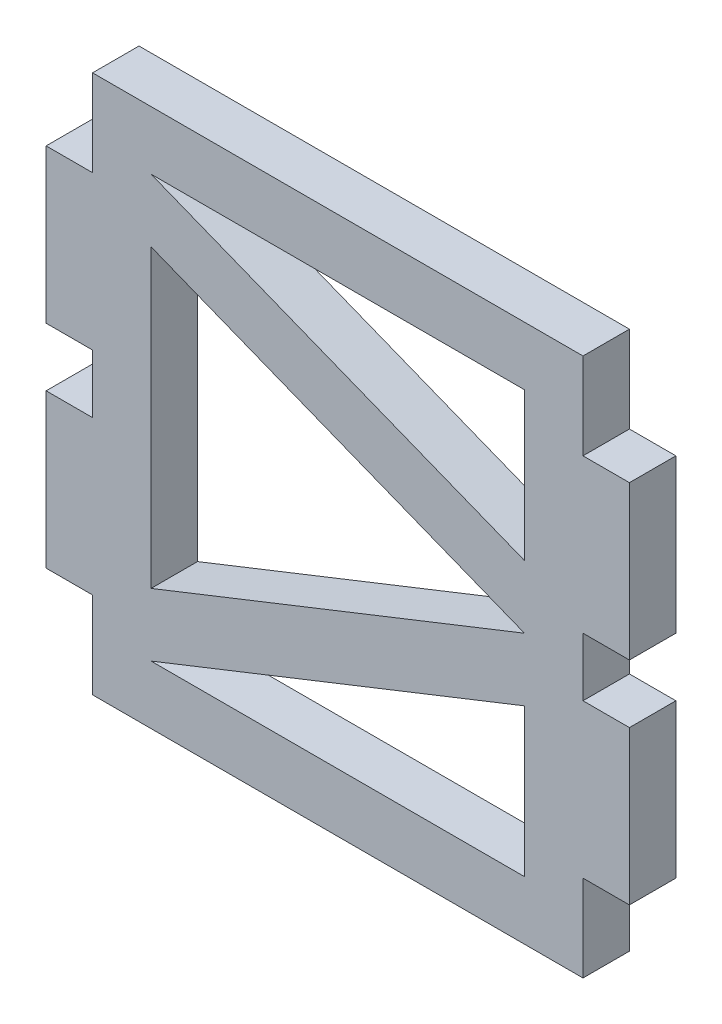
ISO-10303-21;
HEADER;
FILE_DESCRIPTION(('STEP AP214'),'2;1');
FILE_NAME('part.step','',(''),(''),'','','');
FILE_SCHEMA(('AUTOMOTIVE_DESIGN { 1 0 10303 214 1 1 1 1 }'));
ENDSEC;
DATA;
#1=APPLICATION_CONTEXT('core data for automotive mechanical design processes');
#2=APPLICATION_PROTOCOL_DEFINITION('international standard','automotive_design',2000,#1);
#3=PRODUCT_CONTEXT('',#1,'mechanical');
#4=PRODUCT('Part','Part','',(#3));
#5=PRODUCT_RELATED_PRODUCT_CATEGORY('part','',(#4));
#6=PRODUCT_DEFINITION_FORMATION('','',#4);
#7=PRODUCT_DEFINITION_CONTEXT('part definition',#1,'design');
#8=PRODUCT_DEFINITION('design','',#6,#7);
#9=PRODUCT_DEFINITION_SHAPE('','',#8);
#10=(LENGTH_UNIT() NAMED_UNIT(*) SI_UNIT(.MILLI.,.METRE.));
#11=(NAMED_UNIT(*) PLANE_ANGLE_UNIT() SI_UNIT($,.RADIAN.));
#12=(NAMED_UNIT(*) SI_UNIT($,.STERADIAN.) SOLID_ANGLE_UNIT());
#13=UNCERTAINTY_MEASURE_WITH_UNIT(LENGTH_MEASURE(1.E-05),#10,'distance_accuracy_value','');
#14=(GEOMETRIC_REPRESENTATION_CONTEXT(3) GLOBAL_UNCERTAINTY_ASSIGNED_CONTEXT((#13)) GLOBAL_UNIT_ASSIGNED_CONTEXT((#10,
#11,#12)) REPRESENTATION_CONTEXT('',''));
#15=CARTESIAN_POINT('',(0.,0.,0.));
#16=DIRECTION('',(0.,0.,1.));
#17=DIRECTION('',(1.,0.,0.));
#18=AXIS2_PLACEMENT_3D('',#15,#16,#17);
#19=CARTESIAN_POINT('',(7.175,50.1101546560199,57.452953627601));
#20=DIRECTION('',(1.,0.,0.));
#21=DIRECTION('',(0.,1.,0.));
#22=AXIS2_PLACEMENT_3D('',#19,#20,#21);
#23=PLANE('',#22);
#24=DIRECTION('',(0.,0.,-1.));
#25=VECTOR('',#24,1.);
#26=CARTESIAN_POINT('',(7.175,50.1101546560199,57.452953627601));
#27=LINE('',#26,#25);
#28=CARTESIAN_POINT('',(7.175,50.1101546560199,3.175));
#29=VERTEX_POINT('',#28);
#30=CARTESIAN_POINT('',(7.175,50.1101546560199,0.));
#31=VERTEX_POINT('',#30);
#32=EDGE_CURVE('E282',#29,#31,#27,.T.);
#33=ORIENTED_EDGE('',*,*,#32,.F.);
#34=DIRECTION('',(0.,-1.,0.));
#35=VECTOR('',#34,1.);
#36=CARTESIAN_POINT('',(7.175,50.1101546560199,3.175));
#37=LINE('',#36,#35);
#38=CARTESIAN_POINT('',(7.175,29.8898453439801,3.175));
#39=VERTEX_POINT('',#38);
#40=EDGE_CURVE('E589',#29,#39,#37,.T.);
#41=ORIENTED_EDGE('',*,*,#40,.T.);
#42=DIRECTION('',(0.,0.,-1.));
#43=VECTOR('',#42,1.);
#44=CARTESIAN_POINT('',(7.175,29.8898453439801,57.452953627601));
#45=LINE('',#44,#43);
#46=CARTESIAN_POINT('',(7.175,29.8898453439801,0.));
#47=VERTEX_POINT('',#46);
#48=EDGE_CURVE('E280',#39,#47,#45,.T.);
#49=ORIENTED_EDGE('',*,*,#48,.T.);
#50=DIRECTION('',(0.,-1.,0.));
#51=VECTOR('',#50,1.);
#52=CARTESIAN_POINT('',(7.175,50.1101546560199,0.));
#53=LINE('',#52,#51);
#54=EDGE_CURVE('E277',#31,#47,#53,.T.);
#55=ORIENTED_EDGE('',*,*,#54,.F.);
#56=EDGE_LOOP('',(#33,#41,#49,#55));
#57=FACE_BOUND('',#56,.T.);
#58=ADVANCED_FACE('F37',(#57),#23,.T.);
#59=CARTESIAN_POINT('',(32.7,40.,57.452953627601));
#60=DIRECTION('',(-0.368253405634251,-0.92972545906777,0.));
#61=DIRECTION('',(0.92972545906777,-0.368253405634251,0.));
#62=AXIS2_PLACEMENT_3D('',#59,#60,#61);
#63=PLANE('',#62);
#64=DIRECTION('',(0.,0.,-1.));
#65=VECTOR('',#64,1.);
#66=CARTESIAN_POINT('',(32.7,40.,57.452953627601));
#67=LINE('',#66,#65);
#68=CARTESIAN_POINT('',(32.7,40.,3.175));
#69=VERTEX_POINT('',#68);
#70=CARTESIAN_POINT('',(32.7,40.,0.));
#71=VERTEX_POINT('',#70);
#72=EDGE_CURVE('E284',#69,#71,#67,.T.);
#73=ORIENTED_EDGE('',*,*,#72,.F.);
#74=DIRECTION('',(-0.92972545906777,0.368253405634251,0.));
#75=VECTOR('',#74,1.);
#76=CARTESIAN_POINT('',(32.7,40.,3.175));
#77=LINE('',#76,#75);
#78=EDGE_CURVE('E585',#69,#29,#77,.T.);
#79=ORIENTED_EDGE('',*,*,#78,.T.);
#80=ORIENTED_EDGE('',*,*,#32,.T.);
#81=DIRECTION('',(-0.92972545906777,0.368253405634251,0.));
#82=VECTOR('',#81,1.);
#83=CARTESIAN_POINT('',(32.7,40.,0.));
#84=LINE('',#83,#82);
#85=EDGE_CURVE('E274',#71,#31,#84,.T.);
#86=ORIENTED_EDGE('',*,*,#85,.F.);
#87=EDGE_LOOP('',(#73,#79,#80,#86));
#88=FACE_BOUND('',#87,.T.);
#89=ADVANCED_FACE('F638',(#88),#63,.T.);
#90=CARTESIAN_POINT('',(7.175,29.8898453439801,57.452953627601));
#91=DIRECTION('',(-0.368253405634251,0.92972545906777,0.));
#92=DIRECTION('',(-0.92972545906777,-0.368253405634251,0.));
#93=AXIS2_PLACEMENT_3D('',#90,#91,#92);
#94=PLANE('',#93);
#95=ORIENTED_EDGE('',*,*,#48,.F.);
#96=DIRECTION('',(0.92972545906777,0.368253405634251,0.));
#97=VECTOR('',#96,1.);
#98=CARTESIAN_POINT('',(7.175,29.8898453439801,3.175));
#99=LINE('',#98,#97);
#100=EDGE_CURVE('E62',#39,#69,#99,.T.);
#101=ORIENTED_EDGE('',*,*,#100,.T.);
#102=ORIENTED_EDGE('',*,*,#72,.T.);
#103=DIRECTION('',(0.92972545906777,0.368253405634251,0.));
#104=VECTOR('',#103,1.);
#105=CARTESIAN_POINT('',(7.175,29.8898453439801,0.));
#106=LINE('',#105,#104);
#107=EDGE_CURVE('E271',#47,#71,#106,.T.);
#108=ORIENTED_EDGE('',*,*,#107,.F.);
#109=EDGE_LOOP('',(#95,#101,#102,#108));
#110=FACE_BOUND('',#109,.T.);
#111=ADVANCED_FACE('F644',(#110),#94,.T.);
#112=CARTESIAN_POINT('',(3.175,27.5,57.452953627601));
#113=DIRECTION('',(0.,1.,0.));
#114=DIRECTION('',(0.,0.,1.));
#115=AXIS2_PLACEMENT_3D('',#112,#113,#114);
#116=PLANE('',#115);
#117=DIRECTION('',(1.,0.,0.));
#118=VECTOR('',#117,1.);
#119=CARTESIAN_POINT('',(3.175,27.5,3.175));
#120=LINE('',#119,#118);
#121=CARTESIAN_POINT('',(0.,27.5,3.175));
#122=VERTEX_POINT('',#121);
#123=CARTESIAN_POINT('',(3.175,27.5,3.175));
#124=VERTEX_POINT('',#123);
#125=EDGE_CURVE('E575',#122,#124,#120,.T.);
#126=ORIENTED_EDGE('',*,*,#125,.F.);
#127=DIRECTION('',(0.,0.,-1.));
#128=VECTOR('',#127,1.);
#129=CARTESIAN_POINT('',(0.,27.5,57.452953627601));
#130=LINE('',#129,#128);
#131=CARTESIAN_POINT('',(0.,27.5,0.));
#132=VERTEX_POINT('',#131);
#133=EDGE_CURVE('E54',#122,#132,#130,.T.);
#134=ORIENTED_EDGE('',*,*,#133,.T.);
#135=DIRECTION('',(1.,0.,0.));
#136=VECTOR('',#135,1.);
#137=CARTESIAN_POINT('',(3.175,27.5,0.));
#138=LINE('',#137,#136);
#139=CARTESIAN_POINT('',(3.175,27.5,0.));
#140=VERTEX_POINT('',#139);
#141=EDGE_CURVE('E342',#132,#140,#138,.T.);
#142=ORIENTED_EDGE('',*,*,#141,.T.);
#143=DIRECTION('',(0.,0.,-1.));
#144=VECTOR('',#143,1.);
#145=CARTESIAN_POINT('',(3.175,27.5,57.452953627601));
#146=LINE('',#145,#144);
#147=EDGE_CURVE('E345',#124,#140,#146,.T.);
#148=ORIENTED_EDGE('',*,*,#147,.F.);
#149=EDGE_LOOP('',(#126,#134,#142,#148));
#150=FACE_BOUND('',#149,.T.);
#151=ADVANCED_FACE('F401',(#150),#116,.F.);
#152=CARTESIAN_POINT('',(0.,27.5,57.452953627601));
#153=DIRECTION('',(1.,0.,0.));
#154=DIRECTION('',(0.,0.,-1.));
#155=AXIS2_PLACEMENT_3D('',#152,#153,#154);
#156=PLANE('',#155);
#157=DIRECTION('',(0.,-1.,0.));
#158=VECTOR('',#157,1.);
#159=CARTESIAN_POINT('',(0.,27.5,3.175));
#160=LINE('',#159,#158);
#161=CARTESIAN_POINT('',(0.,38.,3.175));
#162=VERTEX_POINT('',#161);
#163=EDGE_CURVE('E408',#162,#122,#160,.T.);
#164=ORIENTED_EDGE('',*,*,#163,.F.);
#165=DIRECTION('',(0.,0.,-1.));
#166=VECTOR('',#165,1.);
#167=CARTESIAN_POINT('',(0.,38.,57.452953627601));
#168=LINE('',#167,#166);
#169=CARTESIAN_POINT('',(0.,38.,0.));
#170=VERTEX_POINT('',#169);
#171=EDGE_CURVE('E348',#162,#170,#168,.T.);
#172=ORIENTED_EDGE('',*,*,#171,.T.);
#173=DIRECTION('',(0.,-1.,0.));
#174=VECTOR('',#173,1.);
#175=CARTESIAN_POINT('',(0.,27.5,0.));
#176=LINE('',#175,#174);
#177=EDGE_CURVE('E340',#170,#132,#176,.T.);
#178=ORIENTED_EDGE('',*,*,#177,.T.);
#179=ORIENTED_EDGE('',*,*,#133,.F.);
#180=EDGE_LOOP('',(#164,#172,#178,#179));
#181=FACE_BOUND('',#180,.T.);
#182=ADVANCED_FACE('F405',(#181),#156,.F.);
#183=CARTESIAN_POINT('',(3.175,38.,57.452953627601));
#184=DIRECTION('',(0.,-1.,0.));
#185=DIRECTION('',(0.,0.,-1.));
#186=AXIS2_PLACEMENT_3D('',#183,#184,#185);
#187=PLANE('',#186);
#188=DIRECTION('',(-1.,0.,0.));
#189=VECTOR('',#188,1.);
#190=CARTESIAN_POINT('',(3.175,38.,3.175));
#191=LINE('',#190,#189);
#192=CARTESIAN_POINT('',(3.175,38.,3.175));
#193=VERTEX_POINT('',#192);
#194=EDGE_CURVE('E413',#193,#162,#191,.T.);
#195=ORIENTED_EDGE('',*,*,#194,.F.);
#196=DIRECTION('',(0.,0.,-1.));
#197=VECTOR('',#196,1.);
#198=CARTESIAN_POINT('',(3.175,38.,57.452953627601));
#199=LINE('',#198,#197);
#200=CARTESIAN_POINT('',(3.175,38.,0.));
#201=VERTEX_POINT('',#200);
#202=EDGE_CURVE('E350',#193,#201,#199,.T.);
#203=ORIENTED_EDGE('',*,*,#202,.T.);
#204=DIRECTION('',(-1.,0.,0.));
#205=VECTOR('',#204,1.);
#206=CARTESIAN_POINT('',(3.175,38.,0.));
#207=LINE('',#206,#205);
#208=EDGE_CURVE('E337',#201,#170,#207,.T.);
#209=ORIENTED_EDGE('',*,*,#208,.T.);
#210=ORIENTED_EDGE('',*,*,#171,.F.);
#211=EDGE_LOOP('',(#195,#203,#209,#210));
#212=FACE_BOUND('',#211,.T.);
#213=ADVANCED_FACE('F411',(#212),#187,.F.);
#214=CARTESIAN_POINT('',(3.175,42.,57.452953627601));
#215=DIRECTION('',(1.,0.,0.));
#216=DIRECTION('',(0.,0.,-1.));
#217=AXIS2_PLACEMENT_3D('',#214,#215,#216);
#218=PLANE('',#217);
#219=DIRECTION('',(0.,-1.,0.));
#220=VECTOR('',#219,1.);
#221=CARTESIAN_POINT('',(3.175,42.,3.175));
#222=LINE('',#221,#220);
#223=CARTESIAN_POINT('',(3.175,42.,3.175));
#224=VERTEX_POINT('',#223);
#225=EDGE_CURVE('E566',#224,#193,#222,.T.);
#226=ORIENTED_EDGE('',*,*,#225,.F.);
#227=DIRECTION('',(0.,0.,-1.));
#228=VECTOR('',#227,1.);
#229=CARTESIAN_POINT('',(3.175,42.,57.452953627601));
#230=LINE('',#229,#228);
#231=CARTESIAN_POINT('',(3.175,42.,0.));
#232=VERTEX_POINT('',#231);
#233=EDGE_CURVE('E352',#224,#232,#230,.T.);
#234=ORIENTED_EDGE('',*,*,#233,.T.);
#235=DIRECTION('',(0.,-1.,0.));
#236=VECTOR('',#235,1.);
#237=CARTESIAN_POINT('',(3.175,42.,0.));
#238=LINE('',#237,#236);
#239=EDGE_CURVE('E334',#232,#201,#238,.T.);
#240=ORIENTED_EDGE('',*,*,#239,.T.);
#241=ORIENTED_EDGE('',*,*,#202,.F.);
#242=EDGE_LOOP('',(#226,#234,#240,#241));
#243=FACE_BOUND('',#242,.T.);
#244=ADVANCED_FACE('F416',(#243),#218,.F.);
#245=CARTESIAN_POINT('',(3.175,42.,57.452953627601));
#246=DIRECTION('',(0.,1.,0.));
#247=DIRECTION('',(0.,0.,1.));
#248=AXIS2_PLACEMENT_3D('',#245,#246,#247);
#249=PLANE('',#248);
#250=DIRECTION('',(1.,0.,0.));
#251=VECTOR('',#250,1.);
#252=CARTESIAN_POINT('',(3.175,42.,3.175));
#253=LINE('',#252,#251);
#254=CARTESIAN_POINT('',(0.,42.,3.175));
#255=VERTEX_POINT('',#254);
#256=EDGE_CURVE('E425',#255,#224,#253,.T.);
#257=ORIENTED_EDGE('',*,*,#256,.F.);
#258=DIRECTION('',(0.,0.,-1.));
#259=VECTOR('',#258,1.);
#260=CARTESIAN_POINT('',(0.,42.,57.452953627601));
#261=LINE('',#260,#259);
#262=CARTESIAN_POINT('',(0.,42.,0.));
#263=VERTEX_POINT('',#262);
#264=EDGE_CURVE('E354',#255,#263,#261,.T.);
#265=ORIENTED_EDGE('',*,*,#264,.T.);
#266=DIRECTION('',(1.,0.,0.));
#267=VECTOR('',#266,1.);
#268=CARTESIAN_POINT('',(3.175,42.,0.));
#269=LINE('',#268,#267);
#270=EDGE_CURVE('E331',#263,#232,#269,.T.);
#271=ORIENTED_EDGE('',*,*,#270,.T.);
#272=ORIENTED_EDGE('',*,*,#233,.F.);
#273=EDGE_LOOP('',(#257,#265,#271,#272));
#274=FACE_BOUND('',#273,.T.);
#275=ADVANCED_FACE('F422',(#274),#249,.F.);
#276=CARTESIAN_POINT('',(0.,42.,57.452953627601));
#277=DIRECTION('',(1.,0.,0.));
#278=DIRECTION('',(0.,0.,-1.));
#279=AXIS2_PLACEMENT_3D('',#276,#277,#278);
#280=PLANE('',#279);
#281=DIRECTION('',(0.,-1.,0.));
#282=VECTOR('',#281,1.);
#283=CARTESIAN_POINT('',(0.,42.,3.175));
#284=LINE('',#283,#282);
#285=CARTESIAN_POINT('',(0.,52.5000000000001,3.175));
#286=VERTEX_POINT('',#285);
#287=EDGE_CURVE('E430',#286,#255,#284,.T.);
#288=ORIENTED_EDGE('',*,*,#287,.F.);
#289=DIRECTION('',(0.,0.,-1.));
#290=VECTOR('',#289,1.);
#291=CARTESIAN_POINT('',(0.,52.5000000000001,57.452953627601));
#292=LINE('',#291,#290);
#293=CARTESIAN_POINT('',(0.,52.5000000000001,0.));
#294=VERTEX_POINT('',#293);
#295=EDGE_CURVE('E356',#286,#294,#292,.T.);
#296=ORIENTED_EDGE('',*,*,#295,.T.);
#297=DIRECTION('',(0.,-1.,0.));
#298=VECTOR('',#297,1.);
#299=CARTESIAN_POINT('',(0.,42.,0.));
#300=LINE('',#299,#298);
#301=EDGE_CURVE('E328',#294,#263,#300,.T.);
#302=ORIENTED_EDGE('',*,*,#301,.T.);
#303=ORIENTED_EDGE('',*,*,#264,.F.);
#304=EDGE_LOOP('',(#288,#296,#302,#303));
#305=FACE_BOUND('',#304,.T.);
#306=ADVANCED_FACE('F428',(#305),#280,.F.);
#307=CARTESIAN_POINT('',(3.175,52.5000000000001,57.452953627601));
#308=DIRECTION('',(0.,-1.,0.));
#309=DIRECTION('',(0.,0.,-1.));
#310=AXIS2_PLACEMENT_3D('',#307,#308,#309);
#311=PLANE('',#310);
#312=DIRECTION('',(-1.,0.,0.));
#313=VECTOR('',#312,1.);
#314=CARTESIAN_POINT('',(3.175,52.5000000000001,3.175));
#315=LINE('',#314,#313);
#316=CARTESIAN_POINT('',(3.175,52.5000000000001,3.175));
#317=VERTEX_POINT('',#316);
#318=EDGE_CURVE('E554',#317,#286,#315,.T.);
#319=ORIENTED_EDGE('',*,*,#318,.F.);
#320=DIRECTION('',(0.,0.,-1.));
#321=VECTOR('',#320,1.);
#322=CARTESIAN_POINT('',(3.175,52.5000000000001,57.452953627601));
#323=LINE('',#322,#321);
#324=CARTESIAN_POINT('',(3.175,52.5000000000001,0.));
#325=VERTEX_POINT('',#324);
#326=EDGE_CURVE('E358',#317,#325,#323,.T.);
#327=ORIENTED_EDGE('',*,*,#326,.T.);
#328=DIRECTION('',(-1.,0.,0.));
#329=VECTOR('',#328,1.);
#330=CARTESIAN_POINT('',(3.175,52.5000000000001,0.));
#331=LINE('',#330,#329);
#332=EDGE_CURVE('E325',#325,#294,#331,.T.);
#333=ORIENTED_EDGE('',*,*,#332,.T.);
#334=ORIENTED_EDGE('',*,*,#295,.F.);
#335=EDGE_LOOP('',(#319,#327,#333,#334));
#336=FACE_BOUND('',#335,.T.);
#337=ADVANCED_FACE('F433',(#336),#311,.F.);
#338=CARTESIAN_POINT('',(3.175,58.4125,57.452953627601));
#339=DIRECTION('',(1.,0.,0.));
#340=DIRECTION('',(0.,0.,-1.));
#341=AXIS2_PLACEMENT_3D('',#338,#339,#340);
#342=PLANE('',#341);
#343=DIRECTION('',(0.,-1.,0.));
#344=VECTOR('',#343,1.);
#345=CARTESIAN_POINT('',(3.175,58.4125,3.175));
#346=LINE('',#345,#344);
#347=CARTESIAN_POINT('',(3.175,58.4125,3.175));
#348=VERTEX_POINT('',#347);
#349=EDGE_CURVE('E442',#348,#317,#346,.T.);
#350=ORIENTED_EDGE('',*,*,#349,.F.);
#351=DIRECTION('',(0.,0.,-1.));
#352=VECTOR('',#351,1.);
#353=CARTESIAN_POINT('',(3.175,58.4125,57.452953627601));
#354=LINE('',#353,#352);
#355=CARTESIAN_POINT('',(3.175,58.4125,0.));
#356=VERTEX_POINT('',#355);
#357=EDGE_CURVE('E360',#348,#356,#354,.T.);
#358=ORIENTED_EDGE('',*,*,#357,.T.);
#359=DIRECTION('',(0.,-1.,0.));
#360=VECTOR('',#359,1.);
#361=CARTESIAN_POINT('',(3.175,58.4125,0.));
#362=LINE('',#361,#360);
#363=EDGE_CURVE('E322',#356,#325,#362,.T.);
#364=ORIENTED_EDGE('',*,*,#363,.T.);
#365=ORIENTED_EDGE('',*,*,#326,.F.);
#366=EDGE_LOOP('',(#350,#358,#364,#365));
#367=FACE_BOUND('',#366,.T.);
#368=ADVANCED_FACE('F439',(#367),#342,.F.);
#369=CARTESIAN_POINT('',(36.7,58.4125,57.452953627601));
#370=DIRECTION('',(0.,-1.,0.));
#371=DIRECTION('',(0.,0.,-1.));
#372=AXIS2_PLACEMENT_3D('',#369,#370,#371);
#373=PLANE('',#372);
#374=DIRECTION('',(-1.,0.,0.));
#375=VECTOR('',#374,1.);
#376=CARTESIAN_POINT('',(36.7,58.4125,3.175));
#377=LINE('',#376,#375);
#378=CARTESIAN_POINT('',(36.7,58.4125,3.175));
#379=VERTEX_POINT('',#378);
#380=EDGE_CURVE('E447',#379,#348,#377,.T.);
#381=ORIENTED_EDGE('',*,*,#380,.F.);
#382=DIRECTION('',(0.,0.,-1.));
#383=VECTOR('',#382,1.);
#384=CARTESIAN_POINT('',(36.7,58.4125,57.452953627601));
#385=LINE('',#384,#383);
#386=CARTESIAN_POINT('',(36.7,58.4125,0.));
#387=VERTEX_POINT('',#386);
#388=EDGE_CURVE('E362',#379,#387,#385,.T.);
#389=ORIENTED_EDGE('',*,*,#388,.T.);
#390=DIRECTION('',(-1.,0.,0.));
#391=VECTOR('',#390,1.);
#392=CARTESIAN_POINT('',(36.7,58.4125,0.));
#393=LINE('',#392,#391);
#394=EDGE_CURVE('E319',#387,#356,#393,.T.);
#395=ORIENTED_EDGE('',*,*,#394,.T.);
#396=ORIENTED_EDGE('',*,*,#357,.F.);
#397=EDGE_LOOP('',(#381,#389,#395,#396));
#398=FACE_BOUND('',#397,.T.);
#399=ADVANCED_FACE('F445',(#398),#373,.F.);
#400=CARTESIAN_POINT('',(36.7,52.5,57.452953627601));
#401=DIRECTION('',(-1.,0.,0.));
#402=DIRECTION('',(0.,0.,1.));
#403=AXIS2_PLACEMENT_3D('',#400,#401,#402);
#404=PLANE('',#403);
#405=DIRECTION('',(0.,1.,0.));
#406=VECTOR('',#405,1.);
#407=CARTESIAN_POINT('',(36.7,52.5,3.175));
#408=LINE('',#407,#406);
#409=CARTESIAN_POINT('',(36.7,52.5,3.175));
#410=VERTEX_POINT('',#409);
#411=EDGE_CURVE('E541',#410,#379,#408,.T.);
#412=ORIENTED_EDGE('',*,*,#411,.F.);
#413=DIRECTION('',(0.,0.,-1.));
#414=VECTOR('',#413,1.);
#415=CARTESIAN_POINT('',(36.7,52.5,57.452953627601));
#416=LINE('',#415,#414);
#417=CARTESIAN_POINT('',(36.7,52.5,0.));
#418=VERTEX_POINT('',#417);
#419=EDGE_CURVE('E364',#410,#418,#416,.T.);
#420=ORIENTED_EDGE('',*,*,#419,.T.);
#421=DIRECTION('',(0.,1.,0.));
#422=VECTOR('',#421,1.);
#423=CARTESIAN_POINT('',(36.7,52.5,0.));
#424=LINE('',#423,#422);
#425=EDGE_CURVE('E316',#418,#387,#424,.T.);
#426=ORIENTED_EDGE('',*,*,#425,.T.);
#427=ORIENTED_EDGE('',*,*,#388,.F.);
#428=EDGE_LOOP('',(#412,#420,#426,#427));
#429=FACE_BOUND('',#428,.T.);
#430=ADVANCED_FACE('F450',(#429),#404,.F.);
#431=CARTESIAN_POINT('',(36.7,52.5,57.452953627601));
#432=DIRECTION('',(0.,-1.,0.));
#433=DIRECTION('',(1.,0.,0.));
#434=AXIS2_PLACEMENT_3D('',#431,#432,#433);
#435=PLANE('',#434);
#436=DIRECTION('',(-1.,0.,0.));
#437=VECTOR('',#436,1.);
#438=CARTESIAN_POINT('',(36.7,52.5,3.175));
#439=LINE('',#438,#437);
#440=CARTESIAN_POINT('',(39.875,52.5000000000001,3.175));
#441=VERTEX_POINT('',#440);
#442=EDGE_CURVE('E459',#441,#410,#439,.T.);
#443=ORIENTED_EDGE('',*,*,#442,.F.);
#444=DIRECTION('',(0.,0.,-1.));
#445=VECTOR('',#444,1.);
#446=CARTESIAN_POINT('',(39.875,52.5000000000001,57.452953627601));
#447=LINE('',#446,#445);
#448=CARTESIAN_POINT('',(39.875,52.5000000000001,0.));
#449=VERTEX_POINT('',#448);
#450=EDGE_CURVE('E366',#441,#449,#447,.T.);
#451=ORIENTED_EDGE('',*,*,#450,.T.);
#452=DIRECTION('',(-1.,0.,0.));
#453=VECTOR('',#452,1.);
#454=CARTESIAN_POINT('',(36.7,52.5,0.));
#455=LINE('',#454,#453);
#456=EDGE_CURVE('E313',#449,#418,#455,.T.);
#457=ORIENTED_EDGE('',*,*,#456,.T.);
#458=ORIENTED_EDGE('',*,*,#419,.F.);
#459=EDGE_LOOP('',(#443,#451,#457,#458));
#460=FACE_BOUND('',#459,.T.);
#461=ADVANCED_FACE('F456',(#460),#435,.F.);
#462=CARTESIAN_POINT('',(39.875,42.,57.452953627601));
#463=DIRECTION('',(-1.,0.,0.));
#464=DIRECTION('',(0.,-1.,0.));
#465=AXIS2_PLACEMENT_3D('',#462,#463,#464);
#466=PLANE('',#465);
#467=DIRECTION('',(0.,1.,0.));
#468=VECTOR('',#467,1.);
#469=CARTESIAN_POINT('',(39.875,42.,3.175));
#470=LINE('',#469,#468);
#471=CARTESIAN_POINT('',(39.875,42.,3.175));
#472=VERTEX_POINT('',#471);
#473=EDGE_CURVE('E464',#472,#441,#470,.T.);
#474=ORIENTED_EDGE('',*,*,#473,.F.);
#475=DIRECTION('',(0.,0.,-1.));
#476=VECTOR('',#475,1.);
#477=CARTESIAN_POINT('',(39.875,42.,57.452953627601));
#478=LINE('',#477,#476);
#479=CARTESIAN_POINT('',(39.875,42.,0.));
#480=VERTEX_POINT('',#479);
#481=EDGE_CURVE('E368',#472,#480,#478,.T.);
#482=ORIENTED_EDGE('',*,*,#481,.T.);
#483=DIRECTION('',(0.,1.,0.));
#484=VECTOR('',#483,1.);
#485=CARTESIAN_POINT('',(39.875,42.,0.));
#486=LINE('',#485,#484);
#487=EDGE_CURVE('E310',#480,#449,#486,.T.);
#488=ORIENTED_EDGE('',*,*,#487,.T.);
#489=ORIENTED_EDGE('',*,*,#450,.F.);
#490=EDGE_LOOP('',(#474,#482,#488,#489));
#491=FACE_BOUND('',#490,.T.);
#492=ADVANCED_FACE('F462',(#491),#466,.F.);
#493=CARTESIAN_POINT('',(36.7,42.,57.452953627601));
#494=DIRECTION('',(0.,1.,0.));
#495=DIRECTION('',(0.,0.,1.));
#496=AXIS2_PLACEMENT_3D('',#493,#494,#495);
#497=PLANE('',#496);
#498=DIRECTION('',(1.,0.,0.));
#499=VECTOR('',#498,1.);
#500=CARTESIAN_POINT('',(36.7,42.,3.175));
#501=LINE('',#500,#499);
#502=CARTESIAN_POINT('',(36.7,42.,3.175));
#503=VERTEX_POINT('',#502);
#504=EDGE_CURVE('E532',#503,#472,#501,.T.);
#505=ORIENTED_EDGE('',*,*,#504,.F.);
#506=DIRECTION('',(0.,0.,-1.));
#507=VECTOR('',#506,1.);
#508=CARTESIAN_POINT('',(36.7,42.,57.452953627601));
#509=LINE('',#508,#507);
#510=CARTESIAN_POINT('',(36.7,42.,0.));
#511=VERTEX_POINT('',#510);
#512=EDGE_CURVE('E370',#503,#511,#509,.T.);
#513=ORIENTED_EDGE('',*,*,#512,.T.);
#514=DIRECTION('',(1.,0.,0.));
#515=VECTOR('',#514,1.);
#516=CARTESIAN_POINT('',(36.7,42.,0.));
#517=LINE('',#516,#515);
#518=EDGE_CURVE('E307',#511,#480,#517,.T.);
#519=ORIENTED_EDGE('',*,*,#518,.T.);
#520=ORIENTED_EDGE('',*,*,#481,.F.);
#521=EDGE_LOOP('',(#505,#513,#519,#520));
#522=FACE_BOUND('',#521,.T.);
#523=ADVANCED_FACE('F467',(#522),#497,.F.);
#524=CARTESIAN_POINT('',(36.7,42.,57.452953627601));
#525=DIRECTION('',(-1.,0.,0.));
#526=DIRECTION('',(0.,-1.,0.));
#527=AXIS2_PLACEMENT_3D('',#524,#525,#526);
#528=PLANE('',#527);
#529=DIRECTION('',(0.,1.,0.));
#530=VECTOR('',#529,1.);
#531=CARTESIAN_POINT('',(36.7,42.,3.175));
#532=LINE('',#531,#530);
#533=CARTESIAN_POINT('',(36.7,38.,3.175));
#534=VERTEX_POINT('',#533);
#535=EDGE_CURVE('E476',#534,#503,#532,.T.);
#536=ORIENTED_EDGE('',*,*,#535,.F.);
#537=DIRECTION('',(0.,0.,-1.));
#538=VECTOR('',#537,1.);
#539=CARTESIAN_POINT('',(36.7,38.,57.452953627601));
#540=LINE('',#539,#538);
#541=CARTESIAN_POINT('',(36.7,38.,0.));
#542=VERTEX_POINT('',#541);
#543=EDGE_CURVE('E372',#534,#542,#540,.T.);
#544=ORIENTED_EDGE('',*,*,#543,.T.);
#545=DIRECTION('',(0.,1.,0.));
#546=VECTOR('',#545,1.);
#547=CARTESIAN_POINT('',(36.7,42.,0.));
#548=LINE('',#547,#546);
#549=EDGE_CURVE('E304',#542,#511,#548,.T.);
#550=ORIENTED_EDGE('',*,*,#549,.T.);
#551=ORIENTED_EDGE('',*,*,#512,.F.);
#552=EDGE_LOOP('',(#536,#544,#550,#551));
#553=FACE_BOUND('',#552,.T.);
#554=ADVANCED_FACE('F473',(#553),#528,.F.);
#555=CARTESIAN_POINT('',(36.7,38.,57.452953627601));
#556=DIRECTION('',(0.,-1.,0.));
#557=DIRECTION('',(1.,0.,0.));
#558=AXIS2_PLACEMENT_3D('',#555,#556,#557);
#559=PLANE('',#558);
#560=DIRECTION('',(-1.,0.,0.));
#561=VECTOR('',#560,1.);
#562=CARTESIAN_POINT('',(36.7,38.,3.175));
#563=LINE('',#562,#561);
#564=CARTESIAN_POINT('',(39.875,38.,3.175));
#565=VERTEX_POINT('',#564);
#566=EDGE_CURVE('E481',#565,#534,#563,.T.);
#567=ORIENTED_EDGE('',*,*,#566,.F.);
#568=DIRECTION('',(0.,0.,-1.));
#569=VECTOR('',#568,1.);
#570=CARTESIAN_POINT('',(39.875,38.,57.452953627601));
#571=LINE('',#570,#569);
#572=CARTESIAN_POINT('',(39.875,38.,0.));
#573=VERTEX_POINT('',#572);
#574=EDGE_CURVE('E374',#565,#573,#571,.T.);
#575=ORIENTED_EDGE('',*,*,#574,.T.);
#576=DIRECTION('',(-1.,0.,0.));
#577=VECTOR('',#576,1.);
#578=CARTESIAN_POINT('',(36.7,38.,0.));
#579=LINE('',#578,#577);
#580=EDGE_CURVE('E301',#573,#542,#579,.T.);
#581=ORIENTED_EDGE('',*,*,#580,.T.);
#582=ORIENTED_EDGE('',*,*,#543,.F.);
#583=EDGE_LOOP('',(#567,#575,#581,#582));
#584=FACE_BOUND('',#583,.T.);
#585=ADVANCED_FACE('F479',(#584),#559,.F.);
#586=CARTESIAN_POINT('',(39.875,27.5,57.452953627601));
#587=DIRECTION('',(-1.,0.,0.));
#588=DIRECTION('',(0.,-1.,0.));
#589=AXIS2_PLACEMENT_3D('',#586,#587,#588);
#590=PLANE('',#589);
#591=DIRECTION('',(0.,1.,0.));
#592=VECTOR('',#591,1.);
#593=CARTESIAN_POINT('',(39.875,27.5,3.175));
#594=LINE('',#593,#592);
#595=CARTESIAN_POINT('',(39.875,27.5,3.175));
#596=VERTEX_POINT('',#595);
#597=EDGE_CURVE('E518',#596,#565,#594,.T.);
#598=ORIENTED_EDGE('',*,*,#597,.F.);
#599=DIRECTION('',(0.,0.,-1.));
#600=VECTOR('',#599,1.);
#601=CARTESIAN_POINT('',(39.875,27.5,57.452953627601));
#602=LINE('',#601,#600);
#603=CARTESIAN_POINT('',(39.875,27.5,0.));
#604=VERTEX_POINT('',#603);
#605=EDGE_CURVE('E376',#596,#604,#602,.T.);
#606=ORIENTED_EDGE('',*,*,#605,.T.);
#607=DIRECTION('',(0.,1.,0.));
#608=VECTOR('',#607,1.);
#609=CARTESIAN_POINT('',(39.875,27.5,0.));
#610=LINE('',#609,#608);
#611=EDGE_CURVE('E298',#604,#573,#610,.T.);
#612=ORIENTED_EDGE('',*,*,#611,.T.);
#613=ORIENTED_EDGE('',*,*,#574,.F.);
#614=EDGE_LOOP('',(#598,#606,#612,#613));
#615=FACE_BOUND('',#614,.T.);
#616=ADVANCED_FACE('F484',(#615),#590,.F.);
#617=CARTESIAN_POINT('',(36.7,27.5,57.452953627601));
#618=DIRECTION('',(0.,1.,0.));
#619=DIRECTION('',(0.,0.,1.));
#620=AXIS2_PLACEMENT_3D('',#617,#618,#619);
#621=PLANE('',#620);
#622=DIRECTION('',(1.,0.,0.));
#623=VECTOR('',#622,1.);
#624=CARTESIAN_POINT('',(36.7,27.5,3.175));
#625=LINE('',#624,#623);
#626=CARTESIAN_POINT('',(36.7,27.5,3.175));
#627=VERTEX_POINT('',#626);
#628=EDGE_CURVE('E490',#627,#596,#625,.T.);
#629=ORIENTED_EDGE('',*,*,#628,.F.);
#630=DIRECTION('',(0.,0.,-1.));
#631=VECTOR('',#630,1.);
#632=CARTESIAN_POINT('',(36.7,27.5,57.452953627601));
#633=LINE('',#632,#631);
#634=CARTESIAN_POINT('',(36.7,27.5,0.));
#635=VERTEX_POINT('',#634);
#636=EDGE_CURVE('E378',#627,#635,#633,.T.);
#637=ORIENTED_EDGE('',*,*,#636,.T.);
#638=DIRECTION('',(1.,0.,0.));
#639=VECTOR('',#638,1.);
#640=CARTESIAN_POINT('',(36.7,27.5,0.));
#641=LINE('',#640,#639);
#642=EDGE_CURVE('E295',#635,#604,#641,.T.);
#643=ORIENTED_EDGE('',*,*,#642,.T.);
#644=ORIENTED_EDGE('',*,*,#605,.F.);
#645=EDGE_LOOP('',(#629,#637,#643,#644));
#646=FACE_BOUND('',#645,.T.);
#647=ADVANCED_FACE('F487',(#646),#621,.F.);
#648=CARTESIAN_POINT('',(36.7,27.5,57.452953627601));
#649=DIRECTION('',(-1.,0.,0.));
#650=DIRECTION('',(0.,0.,1.));
#651=AXIS2_PLACEMENT_3D('',#648,#649,#650);
#652=PLANE('',#651);
#653=DIRECTION('',(0.,1.,0.));
#654=VECTOR('',#653,1.);
#655=CARTESIAN_POINT('',(36.7,27.5,3.175));
#656=LINE('',#655,#654);
#657=CARTESIAN_POINT('',(36.7,21.5875,3.175));
#658=VERTEX_POINT('',#657);
#659=EDGE_CURVE('E494',#658,#627,#656,.T.);
#660=ORIENTED_EDGE('',*,*,#659,.F.);
#661=DIRECTION('',(0.,0.,-1.));
#662=VECTOR('',#661,1.);
#663=CARTESIAN_POINT('',(36.7,21.5875,57.452953627601));
#664=LINE('',#663,#662);
#665=CARTESIAN_POINT('',(36.7,21.5875,0.));
#666=VERTEX_POINT('',#665);
#667=EDGE_CURVE('E380',#658,#666,#664,.T.);
#668=ORIENTED_EDGE('',*,*,#667,.T.);
#669=DIRECTION('',(0.,1.,0.));
#670=VECTOR('',#669,1.);
#671=CARTESIAN_POINT('',(36.7,27.5,0.));
#672=LINE('',#671,#670);
#673=EDGE_CURVE('E292',#666,#635,#672,.T.);
#674=ORIENTED_EDGE('',*,*,#673,.T.);
#675=ORIENTED_EDGE('',*,*,#636,.F.);
#676=EDGE_LOOP('',(#660,#668,#674,#675));
#677=FACE_BOUND('',#676,.T.);
#678=ADVANCED_FACE('F493',(#677),#652,.F.);
#679=CARTESIAN_POINT('',(36.7,21.5875,57.452953627601));
#680=DIRECTION('',(0.,1.,0.));
#681=DIRECTION('',(0.,0.,1.));
#682=AXIS2_PLACEMENT_3D('',#679,#680,#681);
#683=PLANE('',#682);
#684=DIRECTION('',(1.,0.,0.));
#685=VECTOR('',#684,1.);
#686=CARTESIAN_POINT('',(36.7,21.5875,3.175));
#687=LINE('',#686,#685);
#688=CARTESIAN_POINT('',(3.175,21.5875,3.175));
#689=VERTEX_POINT('',#688);
#690=EDGE_CURVE('E388',#689,#658,#687,.T.);
#691=ORIENTED_EDGE('',*,*,#690,.F.);
#692=DIRECTION('',(0.,0.,-1.));
#693=VECTOR('',#692,1.);
#694=CARTESIAN_POINT('',(3.175,21.5875,57.452953627601));
#695=LINE('',#694,#693);
#696=CARTESIAN_POINT('',(3.175,21.5875,0.));
#697=VERTEX_POINT('',#696);
#698=EDGE_CURVE('E47',#689,#697,#695,.T.);
#699=ORIENTED_EDGE('',*,*,#698,.T.);
#700=DIRECTION('',(1.,0.,0.));
#701=VECTOR('',#700,1.);
#702=CARTESIAN_POINT('',(36.7,21.5875,0.));
#703=LINE('',#702,#701);
#704=EDGE_CURVE('E289',#697,#666,#703,.T.);
#705=ORIENTED_EDGE('',*,*,#704,.T.);
#706=ORIENTED_EDGE('',*,*,#667,.F.);
#707=EDGE_LOOP('',(#691,#699,#705,#706));
#708=FACE_BOUND('',#707,.T.);
#709=ADVANCED_FACE('F384',(#708),#683,.F.);
#710=CARTESIAN_POINT('',(3.175,21.5875,57.452953627601));
#711=DIRECTION('',(1.,0.,0.));
#712=DIRECTION('',(0.,0.,-1.));
#713=AXIS2_PLACEMENT_3D('',#710,#711,#712);
#714=PLANE('',#713);
#715=DIRECTION('',(0.,-1.,0.));
#716=VECTOR('',#715,1.);
#717=CARTESIAN_POINT('',(3.175,21.5875,3.175));
#718=LINE('',#717,#716);
#719=EDGE_CURVE('E398',#124,#689,#718,.T.);
#720=ORIENTED_EDGE('',*,*,#719,.F.);
#721=ORIENTED_EDGE('',*,*,#147,.T.);
#722=DIRECTION('',(0.,-1.,0.));
#723=VECTOR('',#722,1.);
#724=CARTESIAN_POINT('',(3.175,21.5875,0.));
#725=LINE('',#724,#723);
#726=EDGE_CURVE('E286',#140,#697,#725,.T.);
#727=ORIENTED_EDGE('',*,*,#726,.T.);
#728=ORIENTED_EDGE('',*,*,#698,.F.);
#729=EDGE_LOOP('',(#720,#721,#727,#728));
#730=FACE_BOUND('',#729,.T.);
#731=ADVANCED_FACE('F39',(#730),#714,.F.);
#732=CARTESIAN_POINT('',(7.175,54.4125,57.452953627601));
#733=DIRECTION('',(0.368253405634251,0.92972545906777,0.));
#734=DIRECTION('',(-0.92972545906777,0.368253405634251,0.));
#735=AXIS2_PLACEMENT_3D('',#732,#733,#734);
#736=PLANE('',#735);
#737=DIRECTION('',(0.,0.,-1.));
#738=VECTOR('',#737,1.);
#739=CARTESIAN_POINT('',(7.175,54.4125,57.452953627601));
#740=LINE('',#739,#738);
#741=CARTESIAN_POINT('',(7.175,54.4125,3.175));
#742=VERTEX_POINT('',#741);
#743=CARTESIAN_POINT('',(7.175,54.4125,0.));
#744=VERTEX_POINT('',#743);
#745=EDGE_CURVE('E267',#742,#744,#740,.T.);
#746=ORIENTED_EDGE('',*,*,#745,.F.);
#747=DIRECTION('',(0.92972545906777,-0.368253405634251,0.));
#748=VECTOR('',#747,1.);
#749=CARTESIAN_POINT('',(7.175,54.4125,3.175));
#750=LINE('',#749,#748);
#751=CARTESIAN_POINT('',(32.7,44.3023453439801,3.175));
#752=VERTEX_POINT('',#751);
#753=EDGE_CURVE('E607',#742,#752,#750,.T.);
#754=ORIENTED_EDGE('',*,*,#753,.T.);
#755=DIRECTION('',(0.,0.,-1.));
#756=VECTOR('',#755,1.);
#757=CARTESIAN_POINT('',(32.7,44.3023453439801,57.452953627601));
#758=LINE('',#757,#756);
#759=CARTESIAN_POINT('',(32.7,44.3023453439801,0.));
#760=VERTEX_POINT('',#759);
#761=EDGE_CURVE('E265',#752,#760,#758,.T.);
#762=ORIENTED_EDGE('',*,*,#761,.T.);
#763=DIRECTION('',(0.92972545906777,-0.368253405634251,0.));
#764=VECTOR('',#763,1.);
#765=CARTESIAN_POINT('',(7.175,54.4125,0.));
#766=LINE('',#765,#764);
#767=EDGE_CURVE('E262',#744,#760,#766,.T.);
#768=ORIENTED_EDGE('',*,*,#767,.F.);
#769=EDGE_LOOP('',(#746,#754,#762,#768));
#770=FACE_BOUND('',#769,.T.);
#771=ADVANCED_FACE('F667',(#770),#736,.T.);
#772=CARTESIAN_POINT('',(32.7,54.4125,57.452953627601));
#773=DIRECTION('',(0.,-1.,0.));
#774=DIRECTION('',(0.,0.,-1.));
#775=AXIS2_PLACEMENT_3D('',#772,#773,#774);
#776=PLANE('',#775);
#777=DIRECTION('',(0.,0.,-1.));
#778=VECTOR('',#777,1.);
#779=CARTESIAN_POINT('',(32.7,54.4125,57.452953627601));
#780=LINE('',#779,#778);
#781=CARTESIAN_POINT('',(32.7,54.4125,3.175));
#782=VERTEX_POINT('',#781);
#783=CARTESIAN_POINT('',(32.7,54.4125,0.));
#784=VERTEX_POINT('',#783);
#785=EDGE_CURVE('E269',#782,#784,#780,.T.);
#786=ORIENTED_EDGE('',*,*,#785,.F.);
#787=DIRECTION('',(-1.,0.,0.));
#788=VECTOR('',#787,1.);
#789=CARTESIAN_POINT('',(32.7,54.4125,3.175));
#790=LINE('',#789,#788);
#791=EDGE_CURVE('E599',#782,#742,#790,.T.);
#792=ORIENTED_EDGE('',*,*,#791,.T.);
#793=ORIENTED_EDGE('',*,*,#745,.T.);
#794=DIRECTION('',(-1.,0.,0.));
#795=VECTOR('',#794,1.);
#796=CARTESIAN_POINT('',(32.7,54.4125,0.));
#797=LINE('',#796,#795);
#798=EDGE_CURVE('E259',#784,#744,#797,.T.);
#799=ORIENTED_EDGE('',*,*,#798,.F.);
#800=EDGE_LOOP('',(#786,#792,#793,#799));
#801=FACE_BOUND('',#800,.T.);
#802=ADVANCED_FACE('F632',(#801),#776,.T.);
#803=CARTESIAN_POINT('',(32.7,44.3023453439801,57.452953627601));
#804=DIRECTION('',(-1.,0.,0.));
#805=DIRECTION('',(0.,0.,1.));
#806=AXIS2_PLACEMENT_3D('',#803,#804,#805);
#807=PLANE('',#806);
#808=ORIENTED_EDGE('',*,*,#761,.F.);
#809=DIRECTION('',(0.,1.,0.));
#810=VECTOR('',#809,1.);
#811=CARTESIAN_POINT('',(32.7,44.3023453439801,3.175));
#812=LINE('',#811,#810);
#813=EDGE_CURVE('E594',#752,#782,#812,.T.);
#814=ORIENTED_EDGE('',*,*,#813,.T.);
#815=ORIENTED_EDGE('',*,*,#785,.T.);
#816=DIRECTION('',(0.,1.,0.));
#817=VECTOR('',#816,1.);
#818=CARTESIAN_POINT('',(32.7,44.3023453439801,0.));
#819=LINE('',#818,#817);
#820=EDGE_CURVE('E252',#760,#784,#819,.T.);
#821=ORIENTED_EDGE('',*,*,#820,.F.);
#822=EDGE_LOOP('',(#808,#814,#815,#821));
#823=FACE_BOUND('',#822,.T.);
#824=ADVANCED_FACE('F624',(#823),#807,.T.);
#825=CARTESIAN_POINT('',(0.,0.,0.));
#826=DIRECTION('',(0.,0.,1.));
#827=DIRECTION('',(1.,0.,0.));
#828=AXIS2_PLACEMENT_3D('',#825,#826,#827);
#829=PLANE('',#828);
#830=ORIENTED_EDGE('',*,*,#820,.T.);
#831=ORIENTED_EDGE('',*,*,#798,.T.);
#832=ORIENTED_EDGE('',*,*,#767,.T.);
#833=EDGE_LOOP('',(#830,#831,#832));
#834=FACE_BOUND('',#833,.T.);
#835=ORIENTED_EDGE('',*,*,#726,.F.);
#836=ORIENTED_EDGE('',*,*,#141,.F.);
#837=ORIENTED_EDGE('',*,*,#177,.F.);
#838=ORIENTED_EDGE('',*,*,#208,.F.);
#839=ORIENTED_EDGE('',*,*,#239,.F.);
#840=ORIENTED_EDGE('',*,*,#270,.F.);
#841=ORIENTED_EDGE('',*,*,#301,.F.);
#842=ORIENTED_EDGE('',*,*,#332,.F.);
#843=ORIENTED_EDGE('',*,*,#363,.F.);
#844=ORIENTED_EDGE('',*,*,#394,.F.);
#845=ORIENTED_EDGE('',*,*,#425,.F.);
#846=ORIENTED_EDGE('',*,*,#456,.F.);
#847=ORIENTED_EDGE('',*,*,#487,.F.);
#848=ORIENTED_EDGE('',*,*,#518,.F.);
#849=ORIENTED_EDGE('',*,*,#549,.F.);
#850=ORIENTED_EDGE('',*,*,#580,.F.);
#851=ORIENTED_EDGE('',*,*,#611,.F.);
#852=ORIENTED_EDGE('',*,*,#642,.F.);
#853=ORIENTED_EDGE('',*,*,#673,.F.);
#854=ORIENTED_EDGE('',*,*,#704,.F.);
#855=EDGE_LOOP('',(#835,#836,#837,#838,#839,#840,#841,#842,#843,#844,#845,#846,#847,#848,#849,
#850,#851,#852,#853,#854));
#856=FACE_BOUND('',#855,.T.);
#857=ORIENTED_EDGE('',*,*,#107,.T.);
#858=ORIENTED_EDGE('',*,*,#85,.T.);
#859=ORIENTED_EDGE('',*,*,#54,.T.);
#860=EDGE_LOOP('',(#857,#858,#859));
#861=FACE_BOUND('',#860,.T.);
#862=DIRECTION('',(1.,0.,0.));
#863=VECTOR('',#862,1.);
#864=CARTESIAN_POINT('',(7.175,25.5875,0.));
#865=LINE('',#864,#863);
#866=CARTESIAN_POINT('',(7.175,25.5875,0.));
#867=VERTEX_POINT('',#866);
#868=CARTESIAN_POINT('',(32.7,25.5875,0.));
#869=VERTEX_POINT('',#868);
#870=EDGE_CURVE('E500',#867,#869,#865,.T.);
#871=ORIENTED_EDGE('',*,*,#870,.T.);
#872=DIRECTION('',(0.,1.,0.));
#873=VECTOR('',#872,1.);
#874=CARTESIAN_POINT('',(32.7,25.5875,0.));
#875=LINE('',#874,#873);
#876=CARTESIAN_POINT('',(32.7,35.6976546560199,0.));
#877=VERTEX_POINT('',#876);
#878=EDGE_CURVE('E621',#869,#877,#875,.T.);
#879=ORIENTED_EDGE('',*,*,#878,.T.);
#880=DIRECTION('',(-0.92972545906777,-0.368253405634252,0.));
#881=VECTOR('',#880,1.);
#882=CARTESIAN_POINT('',(32.7,35.6976546560199,0.));
#883=LINE('',#882,#881);
#884=EDGE_CURVE('E248',#877,#867,#883,.T.);
#885=ORIENTED_EDGE('',*,*,#884,.T.);
#886=EDGE_LOOP('',(#871,#879,#885));
#887=FACE_BOUND('',#886,.T.);
#888=ADVANCED_FACE('F394',(#834,#856,#861,#887),#829,.F.);
#889=CARTESIAN_POINT('',(32.7,35.6976546560199,57.452953627601));
#890=DIRECTION('',(0.368253405634252,-0.92972545906777,0.));
#891=DIRECTION('',(0.92972545906777,0.368253405634252,0.));
#892=AXIS2_PLACEMENT_3D('',#889,#890,#891);
#893=PLANE('',#892);
#894=DIRECTION('',(0.,0.,-1.));
#895=VECTOR('',#894,1.);
#896=CARTESIAN_POINT('',(32.7,35.6976546560199,57.452953627601));
#897=LINE('',#896,#895);
#898=CARTESIAN_POINT('',(32.7,35.6976546560199,3.175));
#899=VERTEX_POINT('',#898);
#900=EDGE_CURVE('E241',#899,#877,#897,.T.);
#901=ORIENTED_EDGE('',*,*,#900,.F.);
#902=DIRECTION('',(-0.92972545906777,-0.368253405634252,0.));
#903=VECTOR('',#902,1.);
#904=CARTESIAN_POINT('',(32.7,35.6976546560199,3.175));
#905=LINE('',#904,#903);
#906=CARTESIAN_POINT('',(7.175,25.5875,3.175));
#907=VERTEX_POINT('',#906);
#908=EDGE_CURVE('E12',#899,#907,#905,.T.);
#909=ORIENTED_EDGE('',*,*,#908,.T.);
#910=DIRECTION('',(0.,0.,-1.));
#911=VECTOR('',#910,1.);
#912=CARTESIAN_POINT('',(7.175,25.5875,57.452953627601));
#913=LINE('',#912,#911);
#914=EDGE_CURVE('E250',#907,#867,#913,.T.);
#915=ORIENTED_EDGE('',*,*,#914,.T.);
#916=ORIENTED_EDGE('',*,*,#884,.F.);
#917=EDGE_LOOP('',(#901,#909,#915,#916));
#918=FACE_BOUND('',#917,.T.);
#919=ADVANCED_FACE('F246',(#918),#893,.T.);
#920=CARTESIAN_POINT('',(32.7,25.5875,57.452953627601));
#921=DIRECTION('',(-1.,0.,0.));
#922=DIRECTION('',(0.,0.,1.));
#923=AXIS2_PLACEMENT_3D('',#920,#921,#922);
#924=PLANE('',#923);
#925=DIRECTION('',(0.,0.,-1.));
#926=VECTOR('',#925,1.);
#927=CARTESIAN_POINT('',(32.7,25.5875,57.452953627601));
#928=LINE('',#927,#926);
#929=CARTESIAN_POINT('',(32.7,25.5875,3.175));
#930=VERTEX_POINT('',#929);
#931=EDGE_CURVE('E243',#930,#869,#928,.T.);
#932=ORIENTED_EDGE('',*,*,#931,.F.);
#933=DIRECTION('',(0.,1.,0.));
#934=VECTOR('',#933,1.);
#935=CARTESIAN_POINT('',(32.7,25.5875,3.175));
#936=LINE('',#935,#934);
#937=EDGE_CURVE('E231',#930,#899,#936,.T.);
#938=ORIENTED_EDGE('',*,*,#937,.T.);
#939=ORIENTED_EDGE('',*,*,#900,.T.);
#940=ORIENTED_EDGE('',*,*,#878,.F.);
#941=EDGE_LOOP('',(#932,#938,#939,#940));
#942=FACE_BOUND('',#941,.T.);
#943=ADVANCED_FACE('F239',(#942),#924,.T.);
#944=CARTESIAN_POINT('',(7.175,25.5875,57.452953627601));
#945=DIRECTION('',(0.,1.,0.));
#946=DIRECTION('',(0.,0.,1.));
#947=AXIS2_PLACEMENT_3D('',#944,#945,#946);
#948=PLANE('',#947);
#949=ORIENTED_EDGE('',*,*,#914,.F.);
#950=DIRECTION('',(1.,0.,0.));
#951=VECTOR('',#950,1.);
#952=CARTESIAN_POINT('',(7.175,25.5875,3.175));
#953=LINE('',#952,#951);
#954=EDGE_CURVE('E234',#907,#930,#953,.T.);
#955=ORIENTED_EDGE('',*,*,#954,.T.);
#956=ORIENTED_EDGE('',*,*,#931,.T.);
#957=ORIENTED_EDGE('',*,*,#870,.F.);
#958=EDGE_LOOP('',(#949,#955,#956,#957));
#959=FACE_BOUND('',#958,.T.);
#960=ADVANCED_FACE('F617',(#959),#948,.T.);
#961=CARTESIAN_POINT('',(25.7304683326953,38.,3.175));
#962=DIRECTION('',(0.,0.,1.));
#963=DIRECTION('',(0.,-1.,0.));
#964=AXIS2_PLACEMENT_3D('',#961,#962,#963);
#965=PLANE('',#964);
#966=ORIENTED_EDGE('',*,*,#954,.F.);
#967=ORIENTED_EDGE('',*,*,#908,.F.);
#968=ORIENTED_EDGE('',*,*,#937,.F.);
#969=EDGE_LOOP('',(#966,#967,#968));
#970=FACE_BOUND('',#969,.T.);
#971=ORIENTED_EDGE('',*,*,#813,.F.);
#972=ORIENTED_EDGE('',*,*,#753,.F.);
#973=ORIENTED_EDGE('',*,*,#791,.F.);
#974=EDGE_LOOP('',(#971,#972,#973));
#975=FACE_BOUND('',#974,.T.);
#976=ORIENTED_EDGE('',*,*,#100,.F.);
#977=ORIENTED_EDGE('',*,*,#40,.F.);
#978=ORIENTED_EDGE('',*,*,#78,.F.);
#979=EDGE_LOOP('',(#976,#977,#978));
#980=FACE_BOUND('',#979,.T.);
#981=ORIENTED_EDGE('',*,*,#125,.T.);
#982=ORIENTED_EDGE('',*,*,#719,.T.);
#983=ORIENTED_EDGE('',*,*,#690,.T.);
#984=ORIENTED_EDGE('',*,*,#659,.T.);
#985=ORIENTED_EDGE('',*,*,#628,.T.);
#986=ORIENTED_EDGE('',*,*,#597,.T.);
#987=ORIENTED_EDGE('',*,*,#566,.T.);
#988=ORIENTED_EDGE('',*,*,#535,.T.);
#989=ORIENTED_EDGE('',*,*,#504,.T.);
#990=ORIENTED_EDGE('',*,*,#473,.T.);
#991=ORIENTED_EDGE('',*,*,#442,.T.);
#992=ORIENTED_EDGE('',*,*,#411,.T.);
#993=ORIENTED_EDGE('',*,*,#380,.T.);
#994=ORIENTED_EDGE('',*,*,#349,.T.);
#995=ORIENTED_EDGE('',*,*,#318,.T.);
#996=ORIENTED_EDGE('',*,*,#287,.T.);
#997=ORIENTED_EDGE('',*,*,#256,.T.);
#998=ORIENTED_EDGE('',*,*,#225,.T.);
#999=ORIENTED_EDGE('',*,*,#194,.T.);
#1000=ORIENTED_EDGE('',*,*,#163,.T.);
#1001=EDGE_LOOP('',(#981,#982,#983,#984,#985,#986,#987,#988,#989,#990,#991,#992,#993,#994,#995,
#996,#997,#998,#999,#1000));
#1002=FACE_BOUND('',#1001,.T.);
#1003=ADVANCED_FACE('F229',(#970,#975,#980,#1002),#965,.T.);
#1004=CLOSED_SHELL('',(#58,#89,#111,#151,#182,#213,#244,#275,#306,#337,#368,#399,#430,#461,#492,
#523,#554,#585,#616,#647,#678,#709,#731,#771,#802,#824,#888,#919,#943,#960,#1003));
#1005=MANIFOLD_SOLID_BREP('B2',#1004);
#1006=ADVANCED_BREP_SHAPE_REPRESENTATION('',(#18,#1005),#14);
#1007=SHAPE_DEFINITION_REPRESENTATION(#9,#1006);
ENDSEC;
END-ISO-10303-21;
